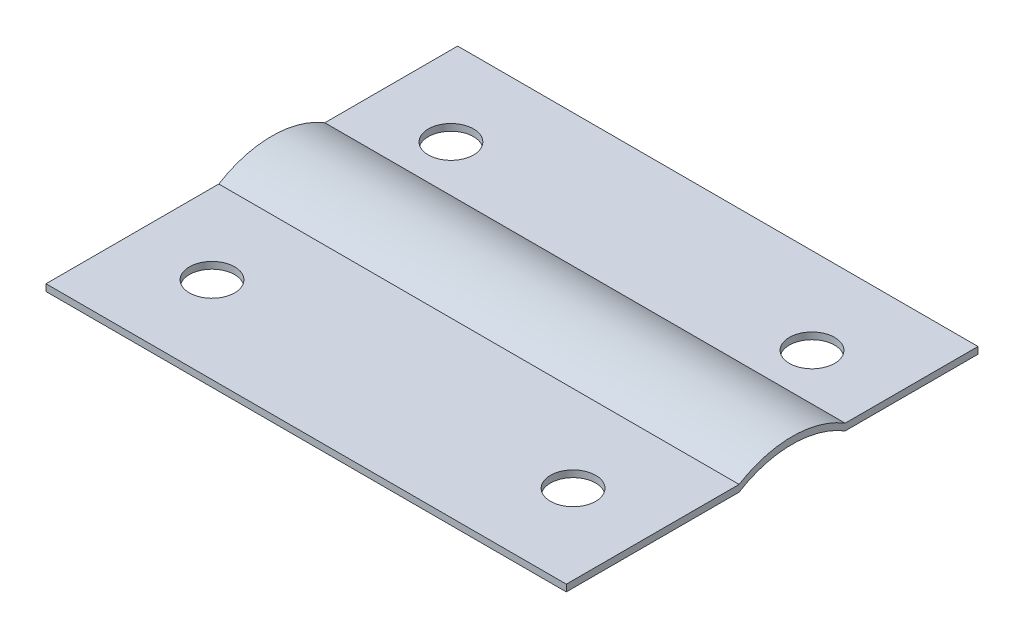
ISO-10303-21;
HEADER;
FILE_DESCRIPTION(('STEP AP214'),'2;1');
FILE_NAME('part.step','',(''),(''),'','','');
FILE_SCHEMA(('AUTOMOTIVE_DESIGN { 1 0 10303 214 1 1 1 1 }'));
ENDSEC;
DATA;
#1=APPLICATION_CONTEXT('core data for automotive mechanical design processes');
#2=APPLICATION_PROTOCOL_DEFINITION('international standard','automotive_design',2000,#1);
#3=PRODUCT_CONTEXT('',#1,'mechanical');
#4=PRODUCT('Part','Part','',(#3));
#5=PRODUCT_RELATED_PRODUCT_CATEGORY('part','',(#4));
#6=PRODUCT_DEFINITION_FORMATION('','',#4);
#7=PRODUCT_DEFINITION_CONTEXT('part definition',#1,'design');
#8=PRODUCT_DEFINITION('design','',#6,#7);
#9=PRODUCT_DEFINITION_SHAPE('','',#8);
#10=(LENGTH_UNIT() NAMED_UNIT(*) SI_UNIT(.MILLI.,.METRE.));
#11=(NAMED_UNIT(*) PLANE_ANGLE_UNIT() SI_UNIT($,.RADIAN.));
#12=(NAMED_UNIT(*) SI_UNIT($,.STERADIAN.) SOLID_ANGLE_UNIT());
#13=UNCERTAINTY_MEASURE_WITH_UNIT(LENGTH_MEASURE(1.E-05),#10,'distance_accuracy_value','');
#14=(GEOMETRIC_REPRESENTATION_CONTEXT(3) GLOBAL_UNCERTAINTY_ASSIGNED_CONTEXT((#13)) GLOBAL_UNIT_ASSIGNED_CONTEXT((#10,
#11,#12)) REPRESENTATION_CONTEXT('',''));
#15=CARTESIAN_POINT('',(0.,0.,0.));
#16=DIRECTION('',(0.,0.,1.));
#17=DIRECTION('',(1.,0.,0.));
#18=AXIS2_PLACEMENT_3D('',#15,#16,#17);
#19=CARTESIAN_POINT('',(39.1668,0.,0.));
#20=DIRECTION('',(0.,0.,-1.));
#21=DIRECTION('',(-1.,0.,0.));
#22=AXIS2_PLACEMENT_3D('',#19,#20,#21);
#23=PLANE('',#22);
#24=DIRECTION('',(0.,-1.,0.));
#25=VECTOR('',#24,1.);
#26=CARTESIAN_POINT('',(0.,0.,0.));
#27=LINE('',#26,#25);
#28=CARTESIAN_POINT('',(0.,0.508,0.));
#29=VERTEX_POINT('',#28);
#30=CARTESIAN_POINT('',(0.,0.,0.));
#31=VERTEX_POINT('',#30);
#32=EDGE_CURVE('E113',#29,#31,#27,.T.);
#33=ORIENTED_EDGE('',*,*,#32,.T.);
#34=DIRECTION('',(-1.,0.,0.));
#35=VECTOR('',#34,1.);
#36=CARTESIAN_POINT('',(39.1668,0.,0.));
#37=LINE('',#36,#35);
#38=CARTESIAN_POINT('',(39.1668,0.,0.));
#39=VERTEX_POINT('',#38);
#40=EDGE_CURVE('E11',#39,#31,#37,.T.);
#41=ORIENTED_EDGE('',*,*,#40,.F.);
#42=DIRECTION('',(0.,-1.,0.));
#43=VECTOR('',#42,1.);
#44=CARTESIAN_POINT('',(39.1668,0.,0.));
#45=LINE('',#44,#43);
#46=CARTESIAN_POINT('',(39.1668,0.508,0.));
#47=VERTEX_POINT('',#46);
#48=EDGE_CURVE('E128',#47,#39,#45,.T.);
#49=ORIENTED_EDGE('',*,*,#48,.F.);
#50=DIRECTION('',(-1.,0.,0.));
#51=VECTOR('',#50,1.);
#52=CARTESIAN_POINT('',(39.1668,0.508,0.));
#53=LINE('',#52,#51);
#54=EDGE_CURVE('E109',#47,#29,#53,.T.);
#55=ORIENTED_EDGE('',*,*,#54,.T.);
#56=EDGE_LOOP('',(#33,#41,#49,#55));
#57=FACE_BOUND('',#56,.T.);
#58=ADVANCED_FACE('F17',(#57),#23,.F.);
#59=CARTESIAN_POINT('',(39.1668,0.,0.));
#60=DIRECTION('',(0.,1.,0.));
#61=DIRECTION('',(0.,0.,1.));
#62=AXIS2_PLACEMENT_3D('',#59,#60,#61);
#63=PLANE('',#62);
#64=CARTESIAN_POINT('',(5.9944,0.,-6.5024));
#65=DIRECTION('',(0.,1.,0.));
#66=DIRECTION('',(0.,0.,1.));
#67=AXIS2_PLACEMENT_3D('',#64,#65,#66);
#68=CIRCLE('',#67,1.7);
#69=CARTESIAN_POINT('',(5.9944,0.,-4.8024));
#70=VERTEX_POINT('',#69);
#71=EDGE_CURVE('E178',#70,#70,#68,.T.);
#72=ORIENTED_EDGE('',*,*,#71,.T.);
#73=EDGE_LOOP('',(#72));
#74=FACE_BOUND('',#73,.T.);
#75=CARTESIAN_POINT('',(33.1724,0.,-6.5024));
#76=DIRECTION('',(0.,1.,0.));
#77=DIRECTION('',(0.,0.,1.));
#78=AXIS2_PLACEMENT_3D('',#75,#76,#77);
#79=CIRCLE('',#78,1.7);
#80=CARTESIAN_POINT('',(33.1724,0.,-4.8024));
#81=VERTEX_POINT('',#80);
#82=EDGE_CURVE('E117',#81,#81,#79,.T.);
#83=ORIENTED_EDGE('',*,*,#82,.T.);
#84=EDGE_LOOP('',(#83));
#85=FACE_BOUND('',#84,.T.);
#86=DIRECTION('',(0.,0.,-1.));
#87=VECTOR('',#86,1.);
#88=CARTESIAN_POINT('',(0.,0.,0.));
#89=LINE('',#88,#87);
#90=CARTESIAN_POINT('',(0.,0.,-13.0048));
#91=VERTEX_POINT('',#90);
#92=EDGE_CURVE('E116',#31,#91,#89,.T.);
#93=ORIENTED_EDGE('',*,*,#92,.T.);
#94=DIRECTION('',(-1.,0.,0.));
#95=VECTOR('',#94,1.);
#96=CARTESIAN_POINT('',(39.1668,0.,-13.0048));
#97=LINE('',#96,#95);
#98=CARTESIAN_POINT('',(39.1668,0.,-13.0048));
#99=VERTEX_POINT('',#98);
#100=EDGE_CURVE('E25',#99,#91,#97,.T.);
#101=ORIENTED_EDGE('',*,*,#100,.F.);
#102=DIRECTION('',(0.,0.,-1.));
#103=VECTOR('',#102,1.);
#104=CARTESIAN_POINT('',(39.1668,0.,0.));
#105=LINE('',#104,#103);
#106=EDGE_CURVE('E76',#39,#99,#105,.T.);
#107=ORIENTED_EDGE('',*,*,#106,.F.);
#108=ORIENTED_EDGE('',*,*,#40,.T.);
#109=EDGE_LOOP('',(#93,#101,#107,#108));
#110=FACE_BOUND('',#109,.T.);
#111=ADVANCED_FACE('F201',(#74,#85,#110),#63,.F.);
#112=CARTESIAN_POINT('',(39.1668,-6.49073346978496,-16.9966390528945));
#113=DIRECTION('',(-1.,0.,0.));
#114=DIRECTION('',(0.,0.,1.));
#115=AXIS2_PLACEMENT_3D('',#112,#113,#114);
#116=CYLINDRICAL_SURFACE('',#115,7.62);
#117=CARTESIAN_POINT('',(0.,-6.49073346978496,-16.9966390528945));
#118=DIRECTION('',(-1.,0.,0.));
#119=DIRECTION('',(0.,0.,1.));
#120=AXIS2_PLACEMENT_3D('',#117,#118,#119);
#121=CIRCLE('',#120,7.62);
#122=CARTESIAN_POINT('',(0.,0.,-20.9884781057889));
#123=VERTEX_POINT('',#122);
#124=EDGE_CURVE('E119',#91,#123,#121,.T.);
#125=ORIENTED_EDGE('',*,*,#124,.T.);
#126=DIRECTION('',(-1.,0.,0.));
#127=VECTOR('',#126,1.);
#128=CARTESIAN_POINT('',(39.1668,0.,-20.9884781057889));
#129=LINE('',#128,#127);
#130=CARTESIAN_POINT('',(39.1668,0.,-20.9884781057889));
#131=VERTEX_POINT('',#130);
#132=EDGE_CURVE('E135',#131,#123,#129,.T.);
#133=ORIENTED_EDGE('',*,*,#132,.F.);
#134=CARTESIAN_POINT('',(39.1668,-6.49073346978496,-16.9966390528945));
#135=DIRECTION('',(-1.,0.,0.));
#136=DIRECTION('',(0.,0.,1.));
#137=AXIS2_PLACEMENT_3D('',#134,#135,#136);
#138=CIRCLE('',#137,7.62);
#139=EDGE_CURVE('E143',#99,#131,#138,.T.);
#140=ORIENTED_EDGE('',*,*,#139,.F.);
#141=ORIENTED_EDGE('',*,*,#100,.T.);
#142=EDGE_LOOP('',(#125,#133,#140,#141));
#143=FACE_BOUND('',#142,.T.);
#144=ADVANCED_FACE('F141',(#143),#116,.F.);
#145=CARTESIAN_POINT('',(39.1668,0.,-20.9884781057889));
#146=DIRECTION('',(0.,1.,0.));
#147=DIRECTION('',(0.,0.,1.));
#148=AXIS2_PLACEMENT_3D('',#145,#146,#147);
#149=PLANE('',#148);
#150=CARTESIAN_POINT('',(5.9944,0.,-24.4856));
#151=DIRECTION('',(0.,1.,0.));
#152=DIRECTION('',(0.,0.,1.));
#153=AXIS2_PLACEMENT_3D('',#150,#151,#152);
#154=CIRCLE('',#153,1.7);
#155=CARTESIAN_POINT('',(5.9944,0.,-22.7856));
#156=VERTEX_POINT('',#155);
#157=EDGE_CURVE('E172',#156,#156,#154,.T.);
#158=ORIENTED_EDGE('',*,*,#157,.T.);
#159=EDGE_LOOP('',(#158));
#160=FACE_BOUND('',#159,.T.);
#161=CARTESIAN_POINT('',(33.1724,0.,-24.4856));
#162=DIRECTION('',(0.,1.,0.));
#163=DIRECTION('',(0.,0.,1.));
#164=AXIS2_PLACEMENT_3D('',#161,#162,#163);
#165=CIRCLE('',#164,1.7);
#166=CARTESIAN_POINT('',(33.1724,0.,-22.7856));
#167=VERTEX_POINT('',#166);
#168=EDGE_CURVE('E166',#167,#167,#165,.T.);
#169=ORIENTED_EDGE('',*,*,#168,.T.);
#170=EDGE_LOOP('',(#169));
#171=FACE_BOUND('',#170,.T.);
#172=DIRECTION('',(0.,0.,-1.));
#173=VECTOR('',#172,1.);
#174=CARTESIAN_POINT('',(0.,0.,-20.9884781057889));
#175=LINE('',#174,#173);
#176=CARTESIAN_POINT('',(0.,0.,-30.988));
#177=VERTEX_POINT('',#176);
#178=EDGE_CURVE('E121',#123,#177,#175,.T.);
#179=ORIENTED_EDGE('',*,*,#178,.T.);
#180=DIRECTION('',(-1.,0.,0.));
#181=VECTOR('',#180,1.);
#182=CARTESIAN_POINT('',(39.1668,0.,-30.988));
#183=LINE('',#182,#181);
#184=CARTESIAN_POINT('',(39.1668,0.,-30.988));
#185=VERTEX_POINT('',#184);
#186=EDGE_CURVE('E132',#185,#177,#183,.T.);
#187=ORIENTED_EDGE('',*,*,#186,.F.);
#188=DIRECTION('',(0.,0.,-1.));
#189=VECTOR('',#188,1.);
#190=CARTESIAN_POINT('',(39.1668,0.,-20.9884781057889));
#191=LINE('',#190,#189);
#192=EDGE_CURVE('E155',#131,#185,#191,.T.);
#193=ORIENTED_EDGE('',*,*,#192,.F.);
#194=ORIENTED_EDGE('',*,*,#132,.T.);
#195=EDGE_LOOP('',(#179,#187,#193,#194));
#196=FACE_BOUND('',#195,.T.);
#197=ADVANCED_FACE('F151',(#160,#171,#196),#149,.F.);
#198=CARTESIAN_POINT('',(39.1668,0.,-30.988));
#199=DIRECTION('',(0.,0.,1.));
#200=DIRECTION('',(1.,0.,0.));
#201=AXIS2_PLACEMENT_3D('',#198,#199,#200);
#202=PLANE('',#201);
#203=DIRECTION('',(0.,1.,0.));
#204=VECTOR('',#203,1.);
#205=CARTESIAN_POINT('',(0.,0.,-30.988));
#206=LINE('',#205,#204);
#207=CARTESIAN_POINT('',(0.,0.508,-30.988));
#208=VERTEX_POINT('',#207);
#209=EDGE_CURVE('E123',#177,#208,#206,.T.);
#210=ORIENTED_EDGE('',*,*,#209,.T.);
#211=DIRECTION('',(-1.,0.,0.));
#212=VECTOR('',#211,1.);
#213=CARTESIAN_POINT('',(39.1668,0.508,-30.988));
#214=LINE('',#213,#212);
#215=CARTESIAN_POINT('',(39.1668,0.508,-30.988));
#216=VERTEX_POINT('',#215);
#217=EDGE_CURVE('E104',#216,#208,#214,.T.);
#218=ORIENTED_EDGE('',*,*,#217,.F.);
#219=DIRECTION('',(0.,1.,0.));
#220=VECTOR('',#219,1.);
#221=CARTESIAN_POINT('',(39.1668,0.,-30.988));
#222=LINE('',#221,#220);
#223=EDGE_CURVE('E95',#185,#216,#222,.T.);
#224=ORIENTED_EDGE('',*,*,#223,.F.);
#225=ORIENTED_EDGE('',*,*,#186,.T.);
#226=EDGE_LOOP('',(#210,#218,#224,#225));
#227=FACE_BOUND('',#226,.T.);
#228=ADVANCED_FACE('F154',(#227),#202,.F.);
#229=CARTESIAN_POINT('',(39.1668,0.508,-20.9884781057889));
#230=DIRECTION('',(0.,-1.,0.));
#231=DIRECTION('',(0.,0.,-1.));
#232=AXIS2_PLACEMENT_3D('',#229,#230,#231);
#233=PLANE('',#232);
#234=CARTESIAN_POINT('',(5.9944,0.508,-24.4856));
#235=DIRECTION('',(0.,1.,0.));
#236=DIRECTION('',(0.,0.,1.));
#237=AXIS2_PLACEMENT_3D('',#234,#235,#236);
#238=CIRCLE('',#237,1.7);
#239=CARTESIAN_POINT('',(5.9944,0.508,-22.7856));
#240=VERTEX_POINT('',#239);
#241=EDGE_CURVE('E175',#240,#240,#238,.T.);
#242=ORIENTED_EDGE('',*,*,#241,.F.);
#243=EDGE_LOOP('',(#242));
#244=FACE_BOUND('',#243,.T.);
#245=CARTESIAN_POINT('',(33.1724,0.508,-24.4856));
#246=DIRECTION('',(0.,1.,0.));
#247=DIRECTION('',(0.,0.,1.));
#248=AXIS2_PLACEMENT_3D('',#245,#246,#247);
#249=CIRCLE('',#248,1.7);
#250=CARTESIAN_POINT('',(33.1724,0.508,-22.7856));
#251=VERTEX_POINT('',#250);
#252=EDGE_CURVE('E169',#251,#251,#249,.T.);
#253=ORIENTED_EDGE('',*,*,#252,.F.);
#254=EDGE_LOOP('',(#253));
#255=FACE_BOUND('',#254,.T.);
#256=DIRECTION('',(0.,0.,1.));
#257=VECTOR('',#256,1.);
#258=CARTESIAN_POINT('',(0.,0.508,-20.9884781057889));
#259=LINE('',#258,#257);
#260=CARTESIAN_POINT('',(0.,0.508,-20.9884781057889));
#261=VERTEX_POINT('',#260);
#262=EDGE_CURVE('E103',#208,#261,#259,.T.);
#263=ORIENTED_EDGE('',*,*,#262,.T.);
#264=DIRECTION('',(-1.,0.,0.));
#265=VECTOR('',#264,1.);
#266=CARTESIAN_POINT('',(39.1668,0.508,-20.9884781057889));
#267=LINE('',#266,#265);
#268=CARTESIAN_POINT('',(39.1668,0.508,-20.9884781057889));
#269=VERTEX_POINT('',#268);
#270=EDGE_CURVE('E100',#269,#261,#267,.T.);
#271=ORIENTED_EDGE('',*,*,#270,.F.);
#272=DIRECTION('',(0.,0.,1.));
#273=VECTOR('',#272,1.);
#274=CARTESIAN_POINT('',(39.1668,0.508,-20.9884781057889));
#275=LINE('',#274,#273);
#276=EDGE_CURVE('E89',#216,#269,#275,.T.);
#277=ORIENTED_EDGE('',*,*,#276,.F.);
#278=ORIENTED_EDGE('',*,*,#217,.T.);
#279=EDGE_LOOP('',(#263,#271,#277,#278));
#280=FACE_BOUND('',#279,.T.);
#281=ADVANCED_FACE('F101',(#244,#255,#280),#233,.F.);
#282=CARTESIAN_POINT('',(39.1668,-5.98273346978496,-16.9966390528945));
#283=DIRECTION('',(-1.,0.,0.));
#284=DIRECTION('',(0.,0.,1.));
#285=AXIS2_PLACEMENT_3D('',#282,#283,#284);
#286=CYLINDRICAL_SURFACE('',#285,7.62);
#287=CARTESIAN_POINT('',(0.,-5.98273346978496,-16.9966390528945));
#288=DIRECTION('',(1.,0.,0.));
#289=DIRECTION('',(0.,0.,1.));
#290=AXIS2_PLACEMENT_3D('',#287,#288,#289);
#291=CIRCLE('',#290,7.62);
#292=CARTESIAN_POINT('',(0.,0.508,-13.0048));
#293=VERTEX_POINT('',#292);
#294=EDGE_CURVE('E62',#261,#293,#291,.T.);
#295=ORIENTED_EDGE('',*,*,#294,.T.);
#296=DIRECTION('',(-1.,0.,0.));
#297=VECTOR('',#296,1.);
#298=CARTESIAN_POINT('',(39.1668,0.508,-13.0048));
#299=LINE('',#298,#297);
#300=CARTESIAN_POINT('',(39.1668,0.508,-13.0048));
#301=VERTEX_POINT('',#300);
#302=EDGE_CURVE('E105',#301,#293,#299,.T.);
#303=ORIENTED_EDGE('',*,*,#302,.F.);
#304=CARTESIAN_POINT('',(39.1668,-5.98273346978496,-16.9966390528945));
#305=DIRECTION('',(1.,0.,0.));
#306=DIRECTION('',(0.,0.,1.));
#307=AXIS2_PLACEMENT_3D('',#304,#305,#306);
#308=CIRCLE('',#307,7.62);
#309=EDGE_CURVE('E93',#269,#301,#308,.T.);
#310=ORIENTED_EDGE('',*,*,#309,.F.);
#311=ORIENTED_EDGE('',*,*,#270,.T.);
#312=EDGE_LOOP('',(#295,#303,#310,#311));
#313=FACE_BOUND('',#312,.T.);
#314=ADVANCED_FACE('F107',(#313),#286,.T.);
#315=CARTESIAN_POINT('',(39.1668,0.508,0.));
#316=DIRECTION('',(0.,-1.,0.));
#317=DIRECTION('',(0.,0.,-1.));
#318=AXIS2_PLACEMENT_3D('',#315,#316,#317);
#319=PLANE('',#318);
#320=CARTESIAN_POINT('',(5.9944,0.508,-6.5024));
#321=DIRECTION('',(0.,1.,0.));
#322=DIRECTION('',(0.,0.,1.));
#323=AXIS2_PLACEMENT_3D('',#320,#321,#322);
#324=CIRCLE('',#323,1.7);
#325=CARTESIAN_POINT('',(5.9944,0.508,-4.8024));
#326=VERTEX_POINT('',#325);
#327=EDGE_CURVE('E181',#326,#326,#324,.T.);
#328=ORIENTED_EDGE('',*,*,#327,.F.);
#329=EDGE_LOOP('',(#328));
#330=FACE_BOUND('',#329,.T.);
#331=CARTESIAN_POINT('',(33.1724,0.508,-6.5024));
#332=DIRECTION('',(0.,1.,0.));
#333=DIRECTION('',(0.,0.,1.));
#334=AXIS2_PLACEMENT_3D('',#331,#332,#333);
#335=CIRCLE('',#334,1.7);
#336=CARTESIAN_POINT('',(33.1724,0.508,-4.8024));
#337=VERTEX_POINT('',#336);
#338=EDGE_CURVE('E163',#337,#337,#335,.T.);
#339=ORIENTED_EDGE('',*,*,#338,.F.);
#340=EDGE_LOOP('',(#339));
#341=FACE_BOUND('',#340,.T.);
#342=DIRECTION('',(0.,0.,1.));
#343=VECTOR('',#342,1.);
#344=CARTESIAN_POINT('',(0.,0.508,0.));
#345=LINE('',#344,#343);
#346=EDGE_CURVE('E68',#293,#29,#345,.T.);
#347=ORIENTED_EDGE('',*,*,#346,.T.);
#348=ORIENTED_EDGE('',*,*,#54,.F.);
#349=DIRECTION('',(0.,0.,1.));
#350=VECTOR('',#349,1.);
#351=CARTESIAN_POINT('',(39.1668,0.508,0.));
#352=LINE('',#351,#350);
#353=EDGE_CURVE('E33',#301,#47,#352,.T.);
#354=ORIENTED_EDGE('',*,*,#353,.F.);
#355=ORIENTED_EDGE('',*,*,#302,.T.);
#356=EDGE_LOOP('',(#347,#348,#354,#355));
#357=FACE_BOUND('',#356,.T.);
#358=ADVANCED_FACE('F188',(#330,#341,#357),#319,.F.);
#359=CARTESIAN_POINT('',(39.1668,-5.98273346978496,-16.9966390528945));
#360=DIRECTION('',(-1.,0.,0.));
#361=DIRECTION('',(0.,0.,1.));
#362=AXIS2_PLACEMENT_3D('',#359,#360,#361);
#363=PLANE('',#362);
#364=ORIENTED_EDGE('',*,*,#48,.T.);
#365=ORIENTED_EDGE('',*,*,#106,.T.);
#366=ORIENTED_EDGE('',*,*,#139,.T.);
#367=ORIENTED_EDGE('',*,*,#192,.T.);
#368=ORIENTED_EDGE('',*,*,#223,.T.);
#369=ORIENTED_EDGE('',*,*,#276,.T.);
#370=ORIENTED_EDGE('',*,*,#309,.T.);
#371=ORIENTED_EDGE('',*,*,#353,.T.);
#372=EDGE_LOOP('',(#364,#365,#366,#367,#368,#369,#370,#371));
#373=FACE_BOUND('',#372,.T.);
#374=ADVANCED_FACE('F91',(#373),#363,.F.);
#375=CARTESIAN_POINT('',(0.,-5.98273346978496,-16.9966390528945));
#376=DIRECTION('',(-1.,0.,0.));
#377=DIRECTION('',(0.,0.,1.));
#378=AXIS2_PLACEMENT_3D('',#375,#376,#377);
#379=PLANE('',#378);
#380=ORIENTED_EDGE('',*,*,#32,.F.);
#381=ORIENTED_EDGE('',*,*,#346,.F.);
#382=ORIENTED_EDGE('',*,*,#294,.F.);
#383=ORIENTED_EDGE('',*,*,#262,.F.);
#384=ORIENTED_EDGE('',*,*,#209,.F.);
#385=ORIENTED_EDGE('',*,*,#178,.F.);
#386=ORIENTED_EDGE('',*,*,#124,.F.);
#387=ORIENTED_EDGE('',*,*,#92,.F.);
#388=EDGE_LOOP('',(#380,#381,#382,#383,#384,#385,#386,#387));
#389=FACE_BOUND('',#388,.T.);
#390=ADVANCED_FACE('F147',(#389),#379,.T.);
#391=CARTESIAN_POINT('',(33.1724,0.508,-6.5024));
#392=DIRECTION('',(0.,1.,0.));
#393=DIRECTION('',(0.,0.,1.));
#394=AXIS2_PLACEMENT_3D('',#391,#392,#393);
#395=CYLINDRICAL_SURFACE('',#394,1.7);
#396=ORIENTED_EDGE('',*,*,#338,.T.);
#397=EDGE_LOOP('',(#396));
#398=FACE_BOUND('',#397,.T.);
#399=ORIENTED_EDGE('',*,*,#82,.F.);
#400=EDGE_LOOP('',(#399));
#401=FACE_BOUND('',#400,.T.);
#402=ADVANCED_FACE('F194',(#398,#401),#395,.F.);
#403=CARTESIAN_POINT('',(33.1724,0.508,-24.4856));
#404=DIRECTION('',(0.,1.,0.));
#405=DIRECTION('',(0.,0.,1.));
#406=AXIS2_PLACEMENT_3D('',#403,#404,#405);
#407=CYLINDRICAL_SURFACE('',#406,1.7);
#408=ORIENTED_EDGE('',*,*,#252,.T.);
#409=EDGE_LOOP('',(#408));
#410=FACE_BOUND('',#409,.T.);
#411=ORIENTED_EDGE('',*,*,#168,.F.);
#412=EDGE_LOOP('',(#411));
#413=FACE_BOUND('',#412,.T.);
#414=ADVANCED_FACE('F197',(#410,#413),#407,.F.);
#415=CARTESIAN_POINT('',(5.9944,0.508,-24.4856));
#416=DIRECTION('',(0.,1.,0.));
#417=DIRECTION('',(0.,0.,1.));
#418=AXIS2_PLACEMENT_3D('',#415,#416,#417);
#419=CYLINDRICAL_SURFACE('',#418,1.7);
#420=ORIENTED_EDGE('',*,*,#241,.T.);
#421=EDGE_LOOP('',(#420));
#422=FACE_BOUND('',#421,.T.);
#423=ORIENTED_EDGE('',*,*,#157,.F.);
#424=EDGE_LOOP('',(#423));
#425=FACE_BOUND('',#424,.T.);
#426=ADVANCED_FACE('F288',(#422,#425),#419,.F.);
#427=CARTESIAN_POINT('',(5.9944,0.508,-6.5024));
#428=DIRECTION('',(0.,1.,0.));
#429=DIRECTION('',(0.,0.,1.));
#430=AXIS2_PLACEMENT_3D('',#427,#428,#429);
#431=CYLINDRICAL_SURFACE('',#430,1.7);
#432=ORIENTED_EDGE('',*,*,#327,.T.);
#433=EDGE_LOOP('',(#432));
#434=FACE_BOUND('',#433,.T.);
#435=ORIENTED_EDGE('',*,*,#71,.F.);
#436=EDGE_LOOP('',(#435));
#437=FACE_BOUND('',#436,.T.);
#438=ADVANCED_FACE('F185',(#434,#437),#431,.F.);
#439=CLOSED_SHELL('',(#58,#111,#144,#197,#228,#281,#314,#358,#374,#390,#402,#414,#426,#438));
#440=MANIFOLD_SOLID_BREP('B1',#439);
#441=ADVANCED_BREP_SHAPE_REPRESENTATION('',(#18,#440),#14);
#442=SHAPE_DEFINITION_REPRESENTATION(#9,#441);
ENDSEC;
END-ISO-10303-21;
